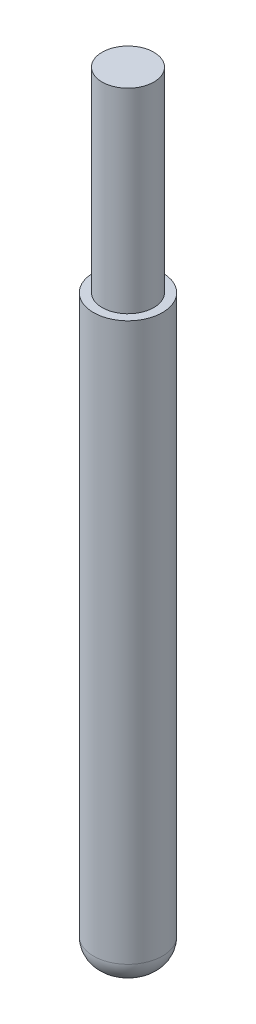
ISO-10303-21;
HEADER;
FILE_DESCRIPTION(('STEP AP214'),'2;1');
FILE_NAME('part.step','',(''),(''),'','','');
FILE_SCHEMA(('AUTOMOTIVE_DESIGN { 1 0 10303 214 1 1 1 1 }'));
ENDSEC;
DATA;
#1=APPLICATION_CONTEXT('core data for automotive mechanical design processes');
#2=APPLICATION_PROTOCOL_DEFINITION('international standard','automotive_design',2000,#1);
#3=PRODUCT_CONTEXT('',#1,'mechanical');
#4=PRODUCT('Part','Part','',(#3));
#5=PRODUCT_RELATED_PRODUCT_CATEGORY('part','',(#4));
#6=PRODUCT_DEFINITION_FORMATION('','',#4);
#7=PRODUCT_DEFINITION_CONTEXT('part definition',#1,'design');
#8=PRODUCT_DEFINITION('design','',#6,#7);
#9=PRODUCT_DEFINITION_SHAPE('','',#8);
#10=(LENGTH_UNIT() NAMED_UNIT(*) SI_UNIT(.MILLI.,.METRE.));
#11=(NAMED_UNIT(*) PLANE_ANGLE_UNIT() SI_UNIT($,.RADIAN.));
#12=(NAMED_UNIT(*) SI_UNIT($,.STERADIAN.) SOLID_ANGLE_UNIT());
#13=UNCERTAINTY_MEASURE_WITH_UNIT(LENGTH_MEASURE(1.E-05),#10,'distance_accuracy_value','');
#14=(GEOMETRIC_REPRESENTATION_CONTEXT(3) GLOBAL_UNCERTAINTY_ASSIGNED_CONTEXT((#13)) GLOBAL_UNIT_ASSIGNED_CONTEXT((#10,
#11,#12)) REPRESENTATION_CONTEXT('',''));
#15=CARTESIAN_POINT('',(0.,0.,0.));
#16=DIRECTION('',(0.,0.,1.));
#17=DIRECTION('',(1.,0.,0.));
#18=AXIS2_PLACEMENT_3D('',#15,#16,#17);
#19=CARTESIAN_POINT('',(0.,50.5,0.));
#20=DIRECTION('',(0.,-1.,0.));
#21=DIRECTION('',(0.,0.,-1.));
#22=AXIS2_PLACEMENT_3D('',#19,#20,#21);
#23=CYLINDRICAL_SURFACE('',#22,3.);
#24=CARTESIAN_POINT('',(0.,2.,0.));
#25=DIRECTION('',(0.,1.,0.));
#26=DIRECTION('',(0.,0.,1.));
#27=AXIS2_PLACEMENT_3D('',#24,#25,#26);
#28=CIRCLE('',#27,3.);
#29=CARTESIAN_POINT('',(0.,2.,3.));
#30=VERTEX_POINT('',#29);
#31=EDGE_CURVE('E44',#30,#30,#28,.T.);
#32=ORIENTED_EDGE('',*,*,#31,.T.);
#33=EDGE_LOOP('',(#32));
#34=FACE_BOUND('',#33,.T.);
#35=CARTESIAN_POINT('',(0.,50.5,0.));
#36=DIRECTION('',(0.,1.,0.));
#37=DIRECTION('',(0.,0.,1.));
#38=AXIS2_PLACEMENT_3D('',#35,#36,#37);
#39=CIRCLE('',#38,3.);
#40=CARTESIAN_POINT('',(0.,50.5,3.));
#41=VERTEX_POINT('',#40);
#42=EDGE_CURVE('E48',#41,#41,#39,.T.);
#43=ORIENTED_EDGE('',*,*,#42,.F.);
#44=EDGE_LOOP('',(#43));
#45=FACE_BOUND('',#44,.T.);
#46=ADVANCED_FACE('F32',(#34,#45),#23,.T.);
#47=CARTESIAN_POINT('',(0.,50.5,0.));
#48=DIRECTION('',(0.,1.,0.));
#49=DIRECTION('',(0.,0.,1.));
#50=AXIS2_PLACEMENT_3D('',#47,#48,#49);
#51=PLANE('',#50);
#52=CARTESIAN_POINT('',(0.,50.5,0.));
#53=DIRECTION('',(0.,1.,0.));
#54=DIRECTION('',(0.,0.,1.));
#55=AXIS2_PLACEMENT_3D('',#52,#53,#54);
#56=CIRCLE('',#55,2.25);
#57=CARTESIAN_POINT('',(0.,50.5,2.25));
#58=VERTEX_POINT('',#57);
#59=EDGE_CURVE('E10',#58,#58,#56,.T.);
#60=ORIENTED_EDGE('',*,*,#59,.F.);
#61=EDGE_LOOP('',(#60));
#62=FACE_BOUND('',#61,.T.);
#63=ORIENTED_EDGE('',*,*,#42,.T.);
#64=EDGE_LOOP('',(#63));
#65=FACE_BOUND('',#64,.T.);
#66=ADVANCED_FACE('F66',(#62,#65),#51,.T.);
#67=CARTESIAN_POINT('',(0.,0.,0.));
#68=DIRECTION('',(0.,1.,0.));
#69=DIRECTION('',(0.,0.,1.));
#70=AXIS2_PLACEMENT_3D('',#67,#68,#69);
#71=PLANE('',#70);
#72=CARTESIAN_POINT('',(0.,0.,0.));
#73=DIRECTION('',(0.,1.,0.));
#74=DIRECTION('',(0.,0.,1.));
#75=AXIS2_PLACEMENT_3D('',#72,#73,#74);
#76=CIRCLE('',#75,1.);
#77=CARTESIAN_POINT('',(0.,0.,1.));
#78=VERTEX_POINT('',#77);
#79=EDGE_CURVE('E36',#78,#78,#76,.F.);
#80=ORIENTED_EDGE('',*,*,#79,.T.);
#81=EDGE_LOOP('',(#80));
#82=FACE_BOUND('',#81,.T.);
#83=ADVANCED_FACE('F57',(#82),#71,.F.);
#84=CARTESIAN_POINT('',(0.,2.,0.));
#85=DIRECTION('',(0.,1.,0.));
#86=DIRECTION('',(0.,0.,1.));
#87=AXIS2_PLACEMENT_3D('',#84,#85,#86);
#88=DEGENERATE_TOROIDAL_SURFACE('',#87,1.,2.,.T.);
#89=ORIENTED_EDGE('',*,*,#79,.F.);
#90=EDGE_LOOP('',(#89));
#91=FACE_BOUND('',#90,.T.);
#92=ORIENTED_EDGE('',*,*,#31,.F.);
#93=EDGE_LOOP('',(#92));
#94=FACE_BOUND('',#93,.T.);
#95=ADVANCED_FACE('F34',(#91,#94),#88,.T.);
#96=CARTESIAN_POINT('',(0.,67.5,0.));
#97=DIRECTION('',(0.,-1.,0.));
#98=DIRECTION('',(0.,0.,-1.));
#99=AXIS2_PLACEMENT_3D('',#96,#97,#98);
#100=CYLINDRICAL_SURFACE('',#99,2.25);
#101=CARTESIAN_POINT('',(0.,67.5,0.));
#102=DIRECTION('',(0.,1.,0.));
#103=DIRECTION('',(0.,0.,1.));
#104=AXIS2_PLACEMENT_3D('',#101,#102,#103);
#105=CIRCLE('',#104,2.25);
#106=CARTESIAN_POINT('',(0.,67.5,2.25));
#107=VERTEX_POINT('',#106);
#108=EDGE_CURVE('E47',#107,#107,#105,.T.);
#109=ORIENTED_EDGE('',*,*,#108,.F.);
#110=EDGE_LOOP('',(#109));
#111=FACE_BOUND('',#110,.T.);
#112=ORIENTED_EDGE('',*,*,#59,.T.);
#113=EDGE_LOOP('',(#112));
#114=FACE_BOUND('',#113,.T.);
#115=ADVANCED_FACE('F56',(#111,#114),#100,.T.);
#116=CARTESIAN_POINT('',(0.,67.5,0.));
#117=DIRECTION('',(0.,1.,0.));
#118=DIRECTION('',(0.,0.,1.));
#119=AXIS2_PLACEMENT_3D('',#116,#117,#118);
#120=PLANE('',#119);
#121=ORIENTED_EDGE('',*,*,#108,.T.);
#122=EDGE_LOOP('',(#121));
#123=FACE_BOUND('',#122,.T.);
#124=ADVANCED_FACE('F63',(#123),#120,.T.);
#125=CLOSED_SHELL('',(#46,#66,#83,#95,#115,#124));
#126=MANIFOLD_SOLID_BREP('B2',#125);
#127=ADVANCED_BREP_SHAPE_REPRESENTATION('',(#18,#126),#14);
#128=SHAPE_DEFINITION_REPRESENTATION(#9,#127);
ENDSEC;
END-ISO-10303-21;
